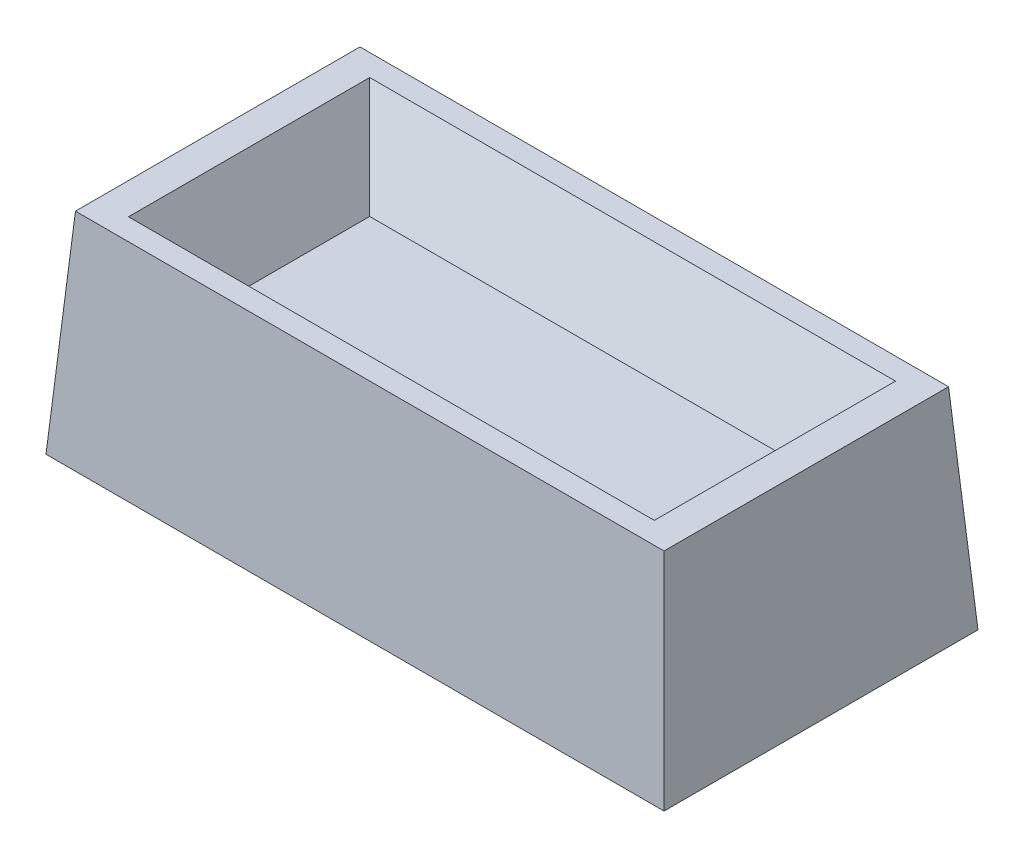
ISO-10303-21;
HEADER;
FILE_DESCRIPTION(('STEP AP214'),'2;1');
FILE_NAME('part.step','',(''),(''),'','','');
FILE_SCHEMA(('AUTOMOTIVE_DESIGN { 1 0 10303 214 1 1 1 1 }'));
ENDSEC;
DATA;
#1=APPLICATION_CONTEXT('core data for automotive mechanical design processes');
#2=APPLICATION_PROTOCOL_DEFINITION('international standard','automotive_design',2000,#1);
#3=PRODUCT_CONTEXT('',#1,'mechanical');
#4=PRODUCT('Part','Part','',(#3));
#5=PRODUCT_RELATED_PRODUCT_CATEGORY('part','',(#4));
#6=PRODUCT_DEFINITION_FORMATION('','',#4);
#7=PRODUCT_DEFINITION_CONTEXT('part definition',#1,'design');
#8=PRODUCT_DEFINITION('design','',#6,#7);
#9=PRODUCT_DEFINITION_SHAPE('','',#8);
#10=(LENGTH_UNIT() NAMED_UNIT(*) SI_UNIT(.MILLI.,.METRE.));
#11=(NAMED_UNIT(*) PLANE_ANGLE_UNIT() SI_UNIT($,.RADIAN.));
#12=(NAMED_UNIT(*) SI_UNIT($,.STERADIAN.) SOLID_ANGLE_UNIT());
#13=UNCERTAINTY_MEASURE_WITH_UNIT(LENGTH_MEASURE(1.E-05),#10,'distance_accuracy_value','');
#14=(GEOMETRIC_REPRESENTATION_CONTEXT(3) GLOBAL_UNCERTAINTY_ASSIGNED_CONTEXT((#13)) GLOBAL_UNIT_ASSIGNED_CONTEXT((#10,
#11,#12)) REPRESENTATION_CONTEXT('',''));
#15=CARTESIAN_POINT('',(0.,0.,0.));
#16=DIRECTION('',(0.,0.,1.));
#17=DIRECTION('',(1.,0.,0.));
#18=AXIS2_PLACEMENT_3D('',#15,#16,#17);
#19=CARTESIAN_POINT('',(102.892841401862,0.,52.2673742227546));
#20=DIRECTION('',(0.997564050259824,0.0697564737441253,0.));
#21=DIRECTION('',(-0.0697564737441253,0.997564050259824,0.));
#22=AXIS2_PLACEMENT_3D('',#19,#20,#21);
#23=PLANE('',#22);
#24=DIRECTION('',(0.,0.,-1.));
#25=VECTOR('',#24,1.);
#26=CARTESIAN_POINT('',(102.892841401862,0.,52.2673742227546));
#27=LINE('',#26,#25);
#28=CARTESIAN_POINT('',(102.892841401862,0.,52.2673742227546));
#29=VERTEX_POINT('',#28);
#30=CARTESIAN_POINT('',(102.892841401862,0.,-52.2673742227546));
#31=VERTEX_POINT('',#30);
#32=EDGE_CURVE('E103',#29,#31,#27,.T.);
#33=ORIENTED_EDGE('',*,*,#32,.T.);
#34=DIRECTION('',(0.0695873743166647,-0.995145815783508,-0.0695873743166647));
#35=VECTOR('',#34,1.);
#36=CARTESIAN_POINT('',(101.896344263182,14.2505730060454,-51.2708770840736));
#37=LINE('',#36,#35);
#38=CARTESIAN_POINT('',(97.9906921773746,70.104,-47.3652249982668));
#39=VERTEX_POINT('',#38);
#40=EDGE_CURVE('E11',#39,#31,#37,.T.);
#41=ORIENTED_EDGE('',*,*,#40,.F.);
#42=DIRECTION('',(0.,0.,1.));
#43=VECTOR('',#42,1.);
#44=CARTESIAN_POINT('',(97.9906921773746,70.104,0.));
#45=LINE('',#44,#43);
#46=CARTESIAN_POINT('',(97.9906921773746,70.104,47.3652249982668));
#47=VERTEX_POINT('',#46);
#48=EDGE_CURVE('E134',#47,#39,#45,.F.);
#49=ORIENTED_EDGE('',*,*,#48,.F.);
#50=DIRECTION('',(0.0695873743166647,-0.995145815783508,0.0695873743166647));
#51=VECTOR('',#50,1.);
#52=CARTESIAN_POINT('',(102.892841401862,0.,52.2673742227546));
#53=LINE('',#52,#51);
#54=EDGE_CURVE('E129',#47,#29,#53,.T.);
#55=ORIENTED_EDGE('',*,*,#54,.T.);
#56=EDGE_LOOP('',(#33,#41,#49,#55));
#57=FACE_BOUND('',#56,.T.);
#58=ADVANCED_FACE('F33',(#57),#23,.T.);
#59=CARTESIAN_POINT('',(-102.892841401862,0.,-52.2673742227546));
#60=DIRECTION('',(0.,0.0697564737441253,-0.997564050259824));
#61=DIRECTION('',(0.,0.997564050259824,0.0697564737441253));
#62=AXIS2_PLACEMENT_3D('',#59,#60,#61);
#63=PLANE('',#62);
#64=DIRECTION('',(-1.,0.,0.));
#65=VECTOR('',#64,1.);
#66=CARTESIAN_POINT('',(-102.892841401862,0.,-52.2673742227546));
#67=LINE('',#66,#65);
#68=CARTESIAN_POINT('',(-102.892841401862,0.,-52.2673742227546));
#69=VERTEX_POINT('',#68);
#70=EDGE_CURVE('E148',#31,#69,#67,.T.);
#71=ORIENTED_EDGE('',*,*,#70,.T.);
#72=DIRECTION('',(-0.0695873743166647,-0.995145815783508,-0.0695873743166647));
#73=VECTOR('',#72,1.);
#74=CARTESIAN_POINT('',(-102.386642057479,7.23898788339008,-51.7611748783715));
#75=LINE('',#74,#73);
#76=CARTESIAN_POINT('',(-97.9906921773746,70.104,-47.3652249982668));
#77=VERTEX_POINT('',#76);
#78=EDGE_CURVE('E43',#77,#69,#75,.T.);
#79=ORIENTED_EDGE('',*,*,#78,.F.);
#80=DIRECTION('',(1.,0.,0.));
#81=VECTOR('',#80,1.);
#82=CARTESIAN_POINT('',(0.,70.104,-47.3652249982668));
#83=LINE('',#82,#81);
#84=EDGE_CURVE('E132',#39,#77,#83,.F.);
#85=ORIENTED_EDGE('',*,*,#84,.F.);
#86=ORIENTED_EDGE('',*,*,#40,.T.);
#87=EDGE_LOOP('',(#71,#79,#85,#86));
#88=FACE_BOUND('',#87,.T.);
#89=ADVANCED_FACE('F172',(#88),#63,.T.);
#90=CARTESIAN_POINT('',(-102.892841401862,0.,52.2673742227546));
#91=DIRECTION('',(-0.997564050259824,0.0697564737441253,0.));
#92=DIRECTION('',(-0.0697564737441253,-0.997564050259824,0.));
#93=AXIS2_PLACEMENT_3D('',#90,#91,#92);
#94=PLANE('',#93);
#95=DIRECTION('',(0.,0.,1.));
#96=VECTOR('',#95,1.);
#97=CARTESIAN_POINT('',(-102.892841401862,0.,52.2673742227546));
#98=LINE('',#97,#96);
#99=CARTESIAN_POINT('',(-102.892841401862,0.,52.2673742227546));
#100=VERTEX_POINT('',#99);
#101=EDGE_CURVE('E146',#69,#100,#98,.T.);
#102=ORIENTED_EDGE('',*,*,#101,.T.);
#103=DIRECTION('',(-0.0695873743166647,-0.995145815783508,0.0695873743166647));
#104=VECTOR('',#103,1.);
#105=CARTESIAN_POINT('',(-102.892841401862,0.,52.2673742227546));
#106=LINE('',#105,#104);
#107=CARTESIAN_POINT('',(-97.9906921773746,70.104,47.3652249982668));
#108=VERTEX_POINT('',#107);
#109=EDGE_CURVE('E140',#108,#100,#106,.T.);
#110=ORIENTED_EDGE('',*,*,#109,.F.);
#111=DIRECTION('',(0.,0.,-1.));
#112=VECTOR('',#111,1.);
#113=CARTESIAN_POINT('',(-97.9906921773746,70.104,0.));
#114=LINE('',#113,#112);
#115=EDGE_CURVE('E130',#77,#108,#114,.F.);
#116=ORIENTED_EDGE('',*,*,#115,.F.);
#117=ORIENTED_EDGE('',*,*,#78,.T.);
#118=EDGE_LOOP('',(#102,#110,#116,#117));
#119=FACE_BOUND('',#118,.T.);
#120=ADVANCED_FACE('F178',(#119),#94,.T.);
#121=CARTESIAN_POINT('',(-102.892841401862,0.,52.2673742227546));
#122=DIRECTION('',(0.,0.0697564737441253,0.997564050259824));
#123=DIRECTION('',(0.,-0.997564050259824,0.0697564737441253));
#124=AXIS2_PLACEMENT_3D('',#121,#122,#123);
#125=PLANE('',#124);
#126=DIRECTION('',(1.,0.,0.));
#127=VECTOR('',#126,1.);
#128=CARTESIAN_POINT('',(-102.892841401862,0.,52.2673742227546));
#129=LINE('',#128,#127);
#130=EDGE_CURVE('E137',#100,#29,#129,.T.);
#131=ORIENTED_EDGE('',*,*,#130,.T.);
#132=ORIENTED_EDGE('',*,*,#54,.F.);
#133=DIRECTION('',(-1.,0.,0.));
#134=VECTOR('',#133,1.);
#135=CARTESIAN_POINT('',(0.,70.104,47.3652249982668));
#136=LINE('',#135,#134);
#137=EDGE_CURVE('E127',#108,#47,#136,.F.);
#138=ORIENTED_EDGE('',*,*,#137,.F.);
#139=ORIENTED_EDGE('',*,*,#109,.T.);
#140=EDGE_LOOP('',(#131,#132,#138,#139));
#141=FACE_BOUND('',#140,.T.);
#142=ADVANCED_FACE('F185',(#141),#125,.T.);
#143=CARTESIAN_POINT('',(0.,70.104,0.));
#144=DIRECTION('',(0.,-1.,0.));
#145=DIRECTION('',(0.,0.,-1.));
#146=AXIS2_PLACEMENT_3D('',#143,#144,#145);
#147=PLANE('',#146);
#148=DIRECTION('',(1.,0.,0.));
#149=VECTOR('',#148,1.);
#150=CARTESIAN_POINT('',(-72.8794328331901,70.104,-40.1517457005861));
#151=LINE('',#150,#149);
#152=CARTESIAN_POINT('',(87.5441296706066,70.104,-40.1517457005861));
#153=VERTEX_POINT('',#152);
#154=CARTESIAN_POINT('',(-87.5441296706066,70.104,-40.1517457005861));
#155=VERTEX_POINT('',#154);
#156=EDGE_CURVE('E118',#153,#155,#151,.F.);
#157=ORIENTED_EDGE('',*,*,#156,.F.);
#158=DIRECTION('',(0.,0.,1.));
#159=VECTOR('',#158,1.);
#160=CARTESIAN_POINT('',(87.5441296706066,70.104,25.4870488631695));
#161=LINE('',#160,#159);
#162=CARTESIAN_POINT('',(87.5441296706066,70.104,40.1517457005861));
#163=VERTEX_POINT('',#162);
#164=EDGE_CURVE('E37',#163,#153,#161,.F.);
#165=ORIENTED_EDGE('',*,*,#164,.F.);
#166=DIRECTION('',(-1.,0.,0.));
#167=VECTOR('',#166,1.);
#168=CARTESIAN_POINT('',(-72.8794328331901,70.104,40.1517457005861));
#169=LINE('',#168,#167);
#170=CARTESIAN_POINT('',(-87.5441296706066,70.104,40.1517457005861));
#171=VERTEX_POINT('',#170);
#172=EDGE_CURVE('E107',#171,#163,#169,.F.);
#173=ORIENTED_EDGE('',*,*,#172,.F.);
#174=DIRECTION('',(0.,0.,-1.));
#175=VECTOR('',#174,1.);
#176=CARTESIAN_POINT('',(-87.5441296706066,70.104,25.4870488631695));
#177=LINE('',#176,#175);
#178=EDGE_CURVE('E112',#155,#171,#177,.F.);
#179=ORIENTED_EDGE('',*,*,#178,.F.);
#180=EDGE_LOOP('',(#157,#165,#173,#179));
#181=FACE_BOUND('',#180,.T.);
#182=ORIENTED_EDGE('',*,*,#48,.T.);
#183=ORIENTED_EDGE('',*,*,#84,.T.);
#184=ORIENTED_EDGE('',*,*,#115,.T.);
#185=ORIENTED_EDGE('',*,*,#137,.T.);
#186=EDGE_LOOP('',(#182,#183,#184,#185));
#187=FACE_BOUND('',#186,.T.);
#188=ADVANCED_FACE('F115',(#181,#187),#147,.F.);
#189=CARTESIAN_POINT('',(0.,0.,0.));
#190=DIRECTION('',(0.,-1.,0.));
#191=DIRECTION('',(0.,0.,-1.));
#192=AXIS2_PLACEMENT_3D('',#189,#190,#191);
#193=PLANE('',#192);
#194=ORIENTED_EDGE('',*,*,#32,.F.);
#195=ORIENTED_EDGE('',*,*,#130,.F.);
#196=ORIENTED_EDGE('',*,*,#101,.F.);
#197=ORIENTED_EDGE('',*,*,#70,.F.);
#198=EDGE_LOOP('',(#194,#195,#196,#197));
#199=FACE_BOUND('',#198,.T.);
#200=ADVANCED_FACE('F183',(#199),#193,.T.);
#201=CARTESIAN_POINT('',(72.8794328331901,44.704,25.4870488631695));
#202=DIRECTION('',(-0.866025403784438,0.500000000000001,0.));
#203=DIRECTION('',(-0.500000000000001,-0.866025403784438,0.));
#204=AXIS2_PLACEMENT_3D('',#201,#202,#203);
#205=PLANE('',#204);
#206=ORIENTED_EDGE('',*,*,#164,.T.);
#207=DIRECTION('',(0.447213595499959,0.774596669241482,-0.447213595499959));
#208=VECTOR('',#207,1.);
#209=CARTESIAN_POINT('',(62.6846132879222,27.0460545735999,-15.2922293179017));
#210=LINE('',#209,#208);
#211=CARTESIAN_POINT('',(72.8794328331901,44.704,-25.4870488631695));
#212=VERTEX_POINT('',#211);
#213=EDGE_CURVE('E93',#212,#153,#210,.T.);
#214=ORIENTED_EDGE('',*,*,#213,.F.);
#215=DIRECTION('',(0.,0.,-1.));
#216=VECTOR('',#215,1.);
#217=CARTESIAN_POINT('',(72.8794328331901,44.704,25.4870488631695));
#218=LINE('',#217,#216);
#219=CARTESIAN_POINT('',(72.8794328331901,44.704,25.4870488631695));
#220=VERTEX_POINT('',#219);
#221=EDGE_CURVE('E99',#220,#212,#218,.T.);
#222=ORIENTED_EDGE('',*,*,#221,.F.);
#223=DIRECTION('',(0.447213595499959,0.774596669241482,0.447213595499959));
#224=VECTOR('',#223,1.);
#225=CARTESIAN_POINT('',(43.727659699914,-5.78835219755546,-3.66472427010659));
#226=LINE('',#225,#224);
#227=EDGE_CURVE('E95',#220,#163,#226,.T.);
#228=ORIENTED_EDGE('',*,*,#227,.T.);
#229=EDGE_LOOP('',(#206,#214,#222,#228));
#230=FACE_BOUND('',#229,.T.);
#231=ADVANCED_FACE('F97',(#230),#205,.T.);
#232=CARTESIAN_POINT('',(-72.8794328331901,44.704,25.4870488631695));
#233=DIRECTION('',(0.,0.500000000000001,-0.866025403784438));
#234=DIRECTION('',(0.,0.866025403784438,0.500000000000001));
#235=AXIS2_PLACEMENT_3D('',#232,#233,#234);
#236=PLANE('',#235);
#237=ORIENTED_EDGE('',*,*,#172,.T.);
#238=ORIENTED_EDGE('',*,*,#227,.F.);
#239=DIRECTION('',(1.,0.,0.));
#240=VECTOR('',#239,1.);
#241=CARTESIAN_POINT('',(-72.8794328331901,44.704,25.4870488631695));
#242=LINE('',#241,#240);
#243=CARTESIAN_POINT('',(-72.8794328331901,44.704,25.4870488631695));
#244=VERTEX_POINT('',#243);
#245=EDGE_CURVE('E125',#244,#220,#242,.T.);
#246=ORIENTED_EDGE('',*,*,#245,.F.);
#247=DIRECTION('',(-0.447213595499959,0.774596669241482,0.447213595499959));
#248=VECTOR('',#247,1.);
#249=CARTESIAN_POINT('',(-72.8794328331901,44.704,25.4870488631695));
#250=LINE('',#249,#248);
#251=EDGE_CURVE('E104',#244,#171,#250,.T.);
#252=ORIENTED_EDGE('',*,*,#251,.T.);
#253=EDGE_LOOP('',(#237,#238,#246,#252));
#254=FACE_BOUND('',#253,.T.);
#255=ADVANCED_FACE('F108',(#254),#236,.T.);
#256=CARTESIAN_POINT('',(-72.8794328331901,44.704,25.4870488631695));
#257=DIRECTION('',(0.866025403784438,0.500000000000001,0.));
#258=DIRECTION('',(-0.500000000000001,0.866025403784438,0.));
#259=AXIS2_PLACEMENT_3D('',#256,#257,#258);
#260=PLANE('',#259);
#261=ORIENTED_EDGE('',*,*,#178,.T.);
#262=ORIENTED_EDGE('',*,*,#251,.F.);
#263=DIRECTION('',(0.,0.,1.));
#264=VECTOR('',#263,1.);
#265=CARTESIAN_POINT('',(-72.8794328331901,44.704,25.4870488631695));
#266=LINE('',#265,#264);
#267=CARTESIAN_POINT('',(-72.8794328331901,44.704,-25.4870488631695));
#268=VERTEX_POINT('',#267);
#269=EDGE_CURVE('E153',#268,#244,#266,.T.);
#270=ORIENTED_EDGE('',*,*,#269,.F.);
#271=DIRECTION('',(-0.447213595499959,0.774596669241482,-0.447213595499959));
#272=VECTOR('',#271,1.);
#273=CARTESIAN_POINT('',(-72.8794328331901,44.704,-25.4870488631695));
#274=LINE('',#273,#272);
#275=EDGE_CURVE('E122',#268,#155,#274,.T.);
#276=ORIENTED_EDGE('',*,*,#275,.T.);
#277=EDGE_LOOP('',(#261,#262,#270,#276));
#278=FACE_BOUND('',#277,.T.);
#279=ADVANCED_FACE('F35',(#278),#260,.T.);
#280=CARTESIAN_POINT('',(-72.8794328331901,44.704,-25.4870488631695));
#281=DIRECTION('',(0.,0.500000000000001,0.866025403784438));
#282=DIRECTION('',(0.,-0.866025403784438,0.500000000000001));
#283=AXIS2_PLACEMENT_3D('',#280,#281,#282);
#284=PLANE('',#283);
#285=ORIENTED_EDGE('',*,*,#156,.T.);
#286=ORIENTED_EDGE('',*,*,#275,.F.);
#287=DIRECTION('',(-1.,0.,0.));
#288=VECTOR('',#287,1.);
#289=CARTESIAN_POINT('',(-72.8794328331901,44.704,-25.4870488631695));
#290=LINE('',#289,#288);
#291=EDGE_CURVE('E156',#212,#268,#290,.T.);
#292=ORIENTED_EDGE('',*,*,#291,.F.);
#293=ORIENTED_EDGE('',*,*,#213,.T.);
#294=EDGE_LOOP('',(#285,#286,#292,#293));
#295=FACE_BOUND('',#294,.T.);
#296=ADVANCED_FACE('F163',(#295),#284,.T.);
#297=CARTESIAN_POINT('',(0.,44.704,0.));
#298=DIRECTION('',(0.,-1.,0.));
#299=DIRECTION('',(0.,0.,-1.));
#300=AXIS2_PLACEMENT_3D('',#297,#298,#299);
#301=PLANE('',#300);
#302=ORIENTED_EDGE('',*,*,#221,.T.);
#303=ORIENTED_EDGE('',*,*,#291,.T.);
#304=ORIENTED_EDGE('',*,*,#269,.T.);
#305=ORIENTED_EDGE('',*,*,#245,.T.);
#306=EDGE_LOOP('',(#302,#303,#304,#305));
#307=FACE_BOUND('',#306,.T.);
#308=ADVANCED_FACE('F160',(#307),#301,.F.);
#309=CLOSED_SHELL('',(#58,#89,#120,#142,#188,#200,#231,#255,#279,#296,#308));
#310=MANIFOLD_SOLID_BREP('B2',#309);
#311=ADVANCED_BREP_SHAPE_REPRESENTATION('',(#18,#310),#14);
#312=SHAPE_DEFINITION_REPRESENTATION(#9,#311);
ENDSEC;
END-ISO-10303-21;
